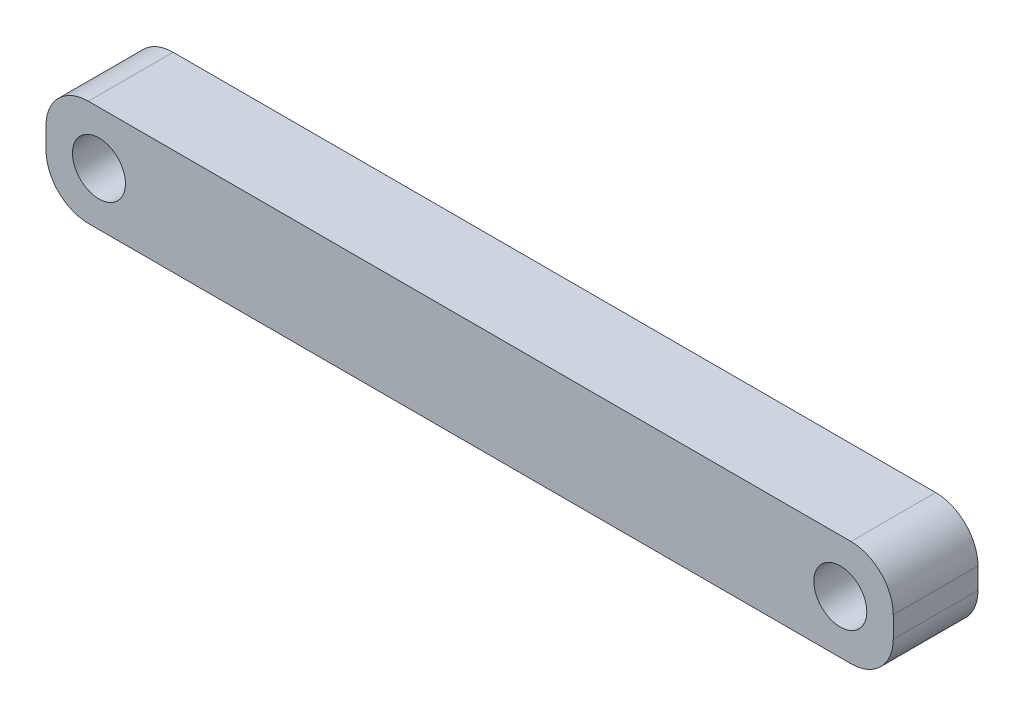
ISO-10303-21;
HEADER;
FILE_DESCRIPTION(('STEP AP214'),'2;1');
FILE_NAME('part.step','',(''),(''),'','','');
FILE_SCHEMA(('AUTOMOTIVE_DESIGN { 1 0 10303 214 1 1 1 1 }'));
ENDSEC;
DATA;
#1=APPLICATION_CONTEXT('core data for automotive mechanical design processes');
#2=APPLICATION_PROTOCOL_DEFINITION('international standard','automotive_design',2000,#1);
#3=PRODUCT_CONTEXT('',#1,'mechanical');
#4=PRODUCT('Part','Part','',(#3));
#5=PRODUCT_RELATED_PRODUCT_CATEGORY('part','',(#4));
#6=PRODUCT_DEFINITION_FORMATION('','',#4);
#7=PRODUCT_DEFINITION_CONTEXT('part definition',#1,'design');
#8=PRODUCT_DEFINITION('design','',#6,#7);
#9=PRODUCT_DEFINITION_SHAPE('','',#8);
#10=(LENGTH_UNIT() NAMED_UNIT(*) SI_UNIT(.MILLI.,.METRE.));
#11=(NAMED_UNIT(*) PLANE_ANGLE_UNIT() SI_UNIT($,.RADIAN.));
#12=(NAMED_UNIT(*) SI_UNIT($,.STERADIAN.) SOLID_ANGLE_UNIT());
#13=UNCERTAINTY_MEASURE_WITH_UNIT(LENGTH_MEASURE(1.E-05),#10,'distance_accuracy_value','');
#14=(GEOMETRIC_REPRESENTATION_CONTEXT(3) GLOBAL_UNCERTAINTY_ASSIGNED_CONTEXT((#13)) GLOBAL_UNIT_ASSIGNED_CONTEXT((#10,
#11,#12)) REPRESENTATION_CONTEXT('',''));
#15=CARTESIAN_POINT('',(0.,0.,0.));
#16=DIRECTION('',(0.,0.,1.));
#17=DIRECTION('',(1.,0.,0.));
#18=AXIS2_PLACEMENT_3D('',#15,#16,#17);
#19=CARTESIAN_POINT('',(0.,0.,8.));
#20=DIRECTION('',(0.,0.,-1.));
#21=DIRECTION('',(-1.,0.,0.));
#22=AXIS2_PLACEMENT_3D('',#19,#20,#21);
#23=PLANE('',#22);
#24=DIRECTION('',(1.,0.,0.));
#25=VECTOR('',#24,1.);
#26=CARTESIAN_POINT('',(-40.,-5.,8.));
#27=LINE('',#26,#25);
#28=CARTESIAN_POINT('',(-36.,-5.,8.));
#29=VERTEX_POINT('',#28);
#30=CARTESIAN_POINT('',(36.,-5.,8.));
#31=VERTEX_POINT('',#30);
#32=EDGE_CURVE('E135',#29,#31,#27,.T.);
#33=ORIENTED_EDGE('',*,*,#32,.T.);
#34=CARTESIAN_POINT('',(36.,-1.,8.));
#35=DIRECTION('',(0.,0.,-1.));
#36=DIRECTION('',(-1.,0.,0.));
#37=AXIS2_PLACEMENT_3D('',#34,#35,#36);
#38=CIRCLE('',#37,4.);
#39=CARTESIAN_POINT('',(40.,-1.,8.));
#40=VERTEX_POINT('',#39);
#41=EDGE_CURVE('E154',#31,#40,#38,.F.);
#42=ORIENTED_EDGE('',*,*,#41,.T.);
#43=DIRECTION('',(0.,1.,0.));
#44=VECTOR('',#43,1.);
#45=CARTESIAN_POINT('',(40.,-5.,8.));
#46=LINE('',#45,#44);
#47=CARTESIAN_POINT('',(40.,1.,8.));
#48=VERTEX_POINT('',#47);
#49=EDGE_CURVE('E118',#40,#48,#46,.T.);
#50=ORIENTED_EDGE('',*,*,#49,.T.);
#51=CARTESIAN_POINT('',(36.,1.,8.));
#52=DIRECTION('',(0.,0.,-1.));
#53=DIRECTION('',(-1.,0.,0.));
#54=AXIS2_PLACEMENT_3D('',#51,#52,#53);
#55=CIRCLE('',#54,4.);
#56=CARTESIAN_POINT('',(36.,5.,8.));
#57=VERTEX_POINT('',#56);
#58=EDGE_CURVE('E152',#48,#57,#55,.F.);
#59=ORIENTED_EDGE('',*,*,#58,.T.);
#60=DIRECTION('',(-1.,0.,0.));
#61=VECTOR('',#60,1.);
#62=CARTESIAN_POINT('',(-40.,5.,8.));
#63=LINE('',#62,#61);
#64=CARTESIAN_POINT('',(-36.,5.,8.));
#65=VERTEX_POINT('',#64);
#66=EDGE_CURVE('E174',#57,#65,#63,.T.);
#67=ORIENTED_EDGE('',*,*,#66,.T.);
#68=CARTESIAN_POINT('',(-36.,1.,8.));
#69=DIRECTION('',(0.,0.,-1.));
#70=DIRECTION('',(-1.,0.,0.));
#71=AXIS2_PLACEMENT_3D('',#68,#69,#70);
#72=CIRCLE('',#71,4.);
#73=CARTESIAN_POINT('',(-40.,1.,8.));
#74=VERTEX_POINT('',#73);
#75=EDGE_CURVE('E53',#65,#74,#72,.F.);
#76=ORIENTED_EDGE('',*,*,#75,.T.);
#77=DIRECTION('',(0.,-1.,0.));
#78=VECTOR('',#77,1.);
#79=CARTESIAN_POINT('',(-40.,-5.,8.));
#80=LINE('',#79,#78);
#81=CARTESIAN_POINT('',(-40.,-1.,8.));
#82=VERTEX_POINT('',#81);
#83=EDGE_CURVE('E164',#74,#82,#80,.T.);
#84=ORIENTED_EDGE('',*,*,#83,.T.);
#85=CARTESIAN_POINT('',(-36.,-1.,8.));
#86=DIRECTION('',(0.,0.,-1.));
#87=DIRECTION('',(-1.,0.,0.));
#88=AXIS2_PLACEMENT_3D('',#85,#86,#87);
#89=CIRCLE('',#88,4.);
#90=EDGE_CURVE('E150',#82,#29,#89,.F.);
#91=ORIENTED_EDGE('',*,*,#90,.T.);
#92=EDGE_LOOP('',(#33,#42,#50,#59,#67,#76,#84,#91));
#93=FACE_BOUND('',#92,.T.);
#94=CARTESIAN_POINT('',(-35.,0.,8.));
#95=DIRECTION('',(0.,0.,1.));
#96=DIRECTION('',(1.,0.,0.));
#97=AXIS2_PLACEMENT_3D('',#94,#95,#96);
#98=CIRCLE('',#97,2.5);
#99=CARTESIAN_POINT('',(-32.5,0.,8.));
#100=VERTEX_POINT('',#99);
#101=EDGE_CURVE('E126',#100,#100,#98,.T.);
#102=ORIENTED_EDGE('',*,*,#101,.F.);
#103=EDGE_LOOP('',(#102));
#104=FACE_BOUND('',#103,.T.);
#105=CARTESIAN_POINT('',(35.,0.,8.));
#106=DIRECTION('',(0.,0.,1.));
#107=DIRECTION('',(1.,0.,0.));
#108=AXIS2_PLACEMENT_3D('',#105,#106,#107);
#109=CIRCLE('',#108,2.49999999999999);
#110=CARTESIAN_POINT('',(37.5,0.,8.));
#111=VERTEX_POINT('',#110);
#112=EDGE_CURVE('E179',#111,#111,#109,.T.);
#113=ORIENTED_EDGE('',*,*,#112,.F.);
#114=EDGE_LOOP('',(#113));
#115=FACE_BOUND('',#114,.T.);
#116=ADVANCED_FACE('F33',(#93,#104,#115),#23,.F.);
#117=CARTESIAN_POINT('',(0.,0.,0.));
#118=DIRECTION('',(0.,0.,-1.));
#119=DIRECTION('',(-1.,0.,0.));
#120=AXIS2_PLACEMENT_3D('',#117,#118,#119);
#121=PLANE('',#120);
#122=CARTESIAN_POINT('',(-35.,0.,0.));
#123=DIRECTION('',(0.,0.,1.));
#124=DIRECTION('',(1.,0.,0.));
#125=AXIS2_PLACEMENT_3D('',#122,#123,#124);
#126=CIRCLE('',#125,2.5);
#127=CARTESIAN_POINT('',(-32.5,0.,0.));
#128=VERTEX_POINT('',#127);
#129=EDGE_CURVE('E132',#128,#128,#126,.T.);
#130=ORIENTED_EDGE('',*,*,#129,.T.);
#131=EDGE_LOOP('',(#130));
#132=FACE_BOUND('',#131,.T.);
#133=DIRECTION('',(0.,1.,0.));
#134=VECTOR('',#133,1.);
#135=CARTESIAN_POINT('',(40.,-5.,0.));
#136=LINE('',#135,#134);
#137=CARTESIAN_POINT('',(40.,-1.,0.));
#138=VERTEX_POINT('',#137);
#139=CARTESIAN_POINT('',(40.,1.,0.));
#140=VERTEX_POINT('',#139);
#141=EDGE_CURVE('E115',#138,#140,#136,.T.);
#142=ORIENTED_EDGE('',*,*,#141,.F.);
#143=CARTESIAN_POINT('',(36.,-1.,0.));
#144=DIRECTION('',(0.,0.,-1.));
#145=DIRECTION('',(-1.,0.,0.));
#146=AXIS2_PLACEMENT_3D('',#143,#144,#145);
#147=CIRCLE('',#146,4.);
#148=CARTESIAN_POINT('',(36.,-5.,0.));
#149=VERTEX_POINT('',#148);
#150=EDGE_CURVE('E98',#138,#149,#147,.T.);
#151=ORIENTED_EDGE('',*,*,#150,.T.);
#152=DIRECTION('',(1.,0.,0.));
#153=VECTOR('',#152,1.);
#154=CARTESIAN_POINT('',(-40.,-5.,0.));
#155=LINE('',#154,#153);
#156=CARTESIAN_POINT('',(-36.,-5.,0.));
#157=VERTEX_POINT('',#156);
#158=EDGE_CURVE('E139',#157,#149,#155,.T.);
#159=ORIENTED_EDGE('',*,*,#158,.F.);
#160=CARTESIAN_POINT('',(-36.,-1.,0.));
#161=DIRECTION('',(0.,0.,-1.));
#162=DIRECTION('',(-1.,0.,0.));
#163=AXIS2_PLACEMENT_3D('',#160,#161,#162);
#164=CIRCLE('',#163,4.);
#165=CARTESIAN_POINT('',(-40.,-1.,0.));
#166=VERTEX_POINT('',#165);
#167=EDGE_CURVE('E143',#157,#166,#164,.T.);
#168=ORIENTED_EDGE('',*,*,#167,.T.);
#169=DIRECTION('',(0.,-1.,0.));
#170=VECTOR('',#169,1.);
#171=CARTESIAN_POINT('',(-40.,-5.,0.));
#172=LINE('',#171,#170);
#173=CARTESIAN_POINT('',(-40.,1.,0.));
#174=VERTEX_POINT('',#173);
#175=EDGE_CURVE('E129',#174,#166,#172,.T.);
#176=ORIENTED_EDGE('',*,*,#175,.F.);
#177=CARTESIAN_POINT('',(-36.,1.,0.));
#178=DIRECTION('',(0.,0.,-1.));
#179=DIRECTION('',(-1.,0.,0.));
#180=AXIS2_PLACEMENT_3D('',#177,#178,#179);
#181=CIRCLE('',#180,4.);
#182=CARTESIAN_POINT('',(-36.,5.,0.));
#183=VERTEX_POINT('',#182);
#184=EDGE_CURVE('E119',#174,#183,#181,.T.);
#185=ORIENTED_EDGE('',*,*,#184,.T.);
#186=DIRECTION('',(-1.,0.,0.));
#187=VECTOR('',#186,1.);
#188=CARTESIAN_POINT('',(-40.,5.,0.));
#189=LINE('',#188,#187);
#190=CARTESIAN_POINT('',(36.,5.,0.));
#191=VERTEX_POINT('',#190);
#192=EDGE_CURVE('E125',#191,#183,#189,.T.);
#193=ORIENTED_EDGE('',*,*,#192,.F.);
#194=CARTESIAN_POINT('',(36.,1.,0.));
#195=DIRECTION('',(0.,0.,-1.));
#196=DIRECTION('',(-1.,0.,0.));
#197=AXIS2_PLACEMENT_3D('',#194,#195,#196);
#198=CIRCLE('',#197,4.);
#199=EDGE_CURVE('E109',#191,#140,#198,.T.);
#200=ORIENTED_EDGE('',*,*,#199,.T.);
#201=EDGE_LOOP('',(#142,#151,#159,#168,#176,#185,#193,#200));
#202=FACE_BOUND('',#201,.T.);
#203=CARTESIAN_POINT('',(35.,0.,0.));
#204=DIRECTION('',(0.,0.,1.));
#205=DIRECTION('',(1.,0.,0.));
#206=AXIS2_PLACEMENT_3D('',#203,#204,#205);
#207=CIRCLE('',#206,2.49999999999999);
#208=CARTESIAN_POINT('',(37.5,0.,0.));
#209=VERTEX_POINT('',#208);
#210=EDGE_CURVE('E181',#209,#209,#207,.T.);
#211=ORIENTED_EDGE('',*,*,#210,.T.);
#212=EDGE_LOOP('',(#211));
#213=FACE_BOUND('',#212,.T.);
#214=ADVANCED_FACE('F122',(#132,#202,#213),#121,.T.);
#215=CARTESIAN_POINT('',(40.,-5.,8.));
#216=DIRECTION('',(-1.,0.,0.));
#217=DIRECTION('',(0.,0.,1.));
#218=AXIS2_PLACEMENT_3D('',#215,#216,#217);
#219=PLANE('',#218);
#220=ORIENTED_EDGE('',*,*,#49,.F.);
#221=DIRECTION('',(0.,0.,-1.));
#222=VECTOR('',#221,1.);
#223=CARTESIAN_POINT('',(40.,-1.,8.));
#224=LINE('',#223,#222);
#225=EDGE_CURVE('E102',#40,#138,#224,.T.);
#226=ORIENTED_EDGE('',*,*,#225,.T.);
#227=ORIENTED_EDGE('',*,*,#141,.T.);
#228=DIRECTION('',(0.,0.,-1.));
#229=VECTOR('',#228,1.);
#230=CARTESIAN_POINT('',(40.,1.,8.));
#231=LINE('',#230,#229);
#232=EDGE_CURVE('E120',#140,#48,#231,.F.);
#233=ORIENTED_EDGE('',*,*,#232,.T.);
#234=EDGE_LOOP('',(#220,#226,#227,#233));
#235=FACE_BOUND('',#234,.T.);
#236=ADVANCED_FACE('F114',(#235),#219,.F.);
#237=CARTESIAN_POINT('',(-40.,5.,8.));
#238=DIRECTION('',(0.,-1.,0.));
#239=DIRECTION('',(0.,0.,-1.));
#240=AXIS2_PLACEMENT_3D('',#237,#238,#239);
#241=PLANE('',#240);
#242=ORIENTED_EDGE('',*,*,#66,.F.);
#243=DIRECTION('',(0.,0.,-1.));
#244=VECTOR('',#243,1.);
#245=CARTESIAN_POINT('',(36.,5.,8.));
#246=LINE('',#245,#244);
#247=EDGE_CURVE('E158',#57,#191,#246,.T.);
#248=ORIENTED_EDGE('',*,*,#247,.T.);
#249=ORIENTED_EDGE('',*,*,#192,.T.);
#250=DIRECTION('',(0.,0.,-1.));
#251=VECTOR('',#250,1.);
#252=CARTESIAN_POINT('',(-36.,5.,8.));
#253=LINE('',#252,#251);
#254=EDGE_CURVE('E156',#183,#65,#253,.F.);
#255=ORIENTED_EDGE('',*,*,#254,.T.);
#256=EDGE_LOOP('',(#242,#248,#249,#255));
#257=FACE_BOUND('',#256,.T.);
#258=ADVANCED_FACE('F206',(#257),#241,.F.);
#259=CARTESIAN_POINT('',(-40.,-5.,8.));
#260=DIRECTION('',(1.,0.,0.));
#261=DIRECTION('',(0.,0.,-1.));
#262=AXIS2_PLACEMENT_3D('',#259,#260,#261);
#263=PLANE('',#262);
#264=ORIENTED_EDGE('',*,*,#175,.T.);
#265=DIRECTION('',(0.,0.,-1.));
#266=VECTOR('',#265,1.);
#267=CARTESIAN_POINT('',(-40.,-1.,8.));
#268=LINE('',#267,#266);
#269=EDGE_CURVE('E11',#166,#82,#268,.F.);
#270=ORIENTED_EDGE('',*,*,#269,.T.);
#271=ORIENTED_EDGE('',*,*,#83,.F.);
#272=DIRECTION('',(0.,0.,-1.));
#273=VECTOR('',#272,1.);
#274=CARTESIAN_POINT('',(-40.,1.,8.));
#275=LINE('',#274,#273);
#276=EDGE_CURVE('E41',#74,#174,#275,.T.);
#277=ORIENTED_EDGE('',*,*,#276,.T.);
#278=EDGE_LOOP('',(#264,#270,#271,#277));
#279=FACE_BOUND('',#278,.T.);
#280=ADVANCED_FACE('F163',(#279),#263,.F.);
#281=CARTESIAN_POINT('',(-40.,-5.,8.));
#282=DIRECTION('',(0.,1.,0.));
#283=DIRECTION('',(0.,0.,1.));
#284=AXIS2_PLACEMENT_3D('',#281,#282,#283);
#285=PLANE('',#284);
#286=ORIENTED_EDGE('',*,*,#158,.T.);
#287=DIRECTION('',(0.,0.,-1.));
#288=VECTOR('',#287,1.);
#289=CARTESIAN_POINT('',(36.,-5.,8.));
#290=LINE('',#289,#288);
#291=EDGE_CURVE('E103',#149,#31,#290,.F.);
#292=ORIENTED_EDGE('',*,*,#291,.T.);
#293=ORIENTED_EDGE('',*,*,#32,.F.);
#294=DIRECTION('',(0.,0.,-1.));
#295=VECTOR('',#294,1.);
#296=CARTESIAN_POINT('',(-36.,-5.,8.));
#297=LINE('',#296,#295);
#298=EDGE_CURVE('E108',#29,#157,#297,.T.);
#299=ORIENTED_EDGE('',*,*,#298,.T.);
#300=EDGE_LOOP('',(#286,#292,#293,#299));
#301=FACE_BOUND('',#300,.T.);
#302=ADVANCED_FACE('F172',(#301),#285,.F.);
#303=CARTESIAN_POINT('',(-35.,0.,8.));
#304=DIRECTION('',(0.,0.,-1.));
#305=DIRECTION('',(-1.,0.,0.));
#306=AXIS2_PLACEMENT_3D('',#303,#304,#305);
#307=CYLINDRICAL_SURFACE('',#306,2.5);
#308=ORIENTED_EDGE('',*,*,#101,.T.);
#309=EDGE_LOOP('',(#308));
#310=FACE_BOUND('',#309,.T.);
#311=ORIENTED_EDGE('',*,*,#129,.F.);
#312=EDGE_LOOP('',(#311));
#313=FACE_BOUND('',#312,.T.);
#314=ADVANCED_FACE('F199',(#310,#313),#307,.F.);
#315=CARTESIAN_POINT('',(35.,0.,8.));
#316=DIRECTION('',(0.,0.,-1.));
#317=DIRECTION('',(-1.,0.,0.));
#318=AXIS2_PLACEMENT_3D('',#315,#316,#317);
#319=CYLINDRICAL_SURFACE('',#318,2.49999999999999);
#320=ORIENTED_EDGE('',*,*,#112,.T.);
#321=EDGE_LOOP('',(#320));
#322=FACE_BOUND('',#321,.T.);
#323=ORIENTED_EDGE('',*,*,#210,.F.);
#324=EDGE_LOOP('',(#323));
#325=FACE_BOUND('',#324,.T.);
#326=ADVANCED_FACE('F187',(#322,#325),#319,.F.);
#327=CARTESIAN_POINT('',(36.,-1.,8.));
#328=DIRECTION('',(0.,0.,-1.));
#329=DIRECTION('',(-1.,0.,0.));
#330=AXIS2_PLACEMENT_3D('',#327,#328,#329);
#331=CYLINDRICAL_SURFACE('',#330,4.);
#332=ORIENTED_EDGE('',*,*,#41,.F.);
#333=ORIENTED_EDGE('',*,*,#291,.F.);
#334=ORIENTED_EDGE('',*,*,#150,.F.);
#335=ORIENTED_EDGE('',*,*,#225,.F.);
#336=EDGE_LOOP('',(#332,#333,#334,#335));
#337=FACE_BOUND('',#336,.T.);
#338=ADVANCED_FACE('F101',(#337),#331,.T.);
#339=CARTESIAN_POINT('',(36.,1.,8.));
#340=DIRECTION('',(0.,0.,-1.));
#341=DIRECTION('',(-1.,0.,0.));
#342=AXIS2_PLACEMENT_3D('',#339,#340,#341);
#343=CYLINDRICAL_SURFACE('',#342,4.);
#344=ORIENTED_EDGE('',*,*,#58,.F.);
#345=ORIENTED_EDGE('',*,*,#232,.F.);
#346=ORIENTED_EDGE('',*,*,#199,.F.);
#347=ORIENTED_EDGE('',*,*,#247,.F.);
#348=EDGE_LOOP('',(#344,#345,#346,#347));
#349=FACE_BOUND('',#348,.T.);
#350=ADVANCED_FACE('F214',(#349),#343,.T.);
#351=CARTESIAN_POINT('',(-36.,-1.,8.));
#352=DIRECTION('',(0.,0.,-1.));
#353=DIRECTION('',(-1.,0.,0.));
#354=AXIS2_PLACEMENT_3D('',#351,#352,#353);
#355=CYLINDRICAL_SURFACE('',#354,4.);
#356=ORIENTED_EDGE('',*,*,#90,.F.);
#357=ORIENTED_EDGE('',*,*,#269,.F.);
#358=ORIENTED_EDGE('',*,*,#167,.F.);
#359=ORIENTED_EDGE('',*,*,#298,.F.);
#360=EDGE_LOOP('',(#356,#357,#358,#359));
#361=FACE_BOUND('',#360,.T.);
#362=ADVANCED_FACE('F169',(#361),#355,.T.);
#363=CARTESIAN_POINT('',(-36.,1.,8.));
#364=DIRECTION('',(0.,0.,-1.));
#365=DIRECTION('',(-1.,0.,0.));
#366=AXIS2_PLACEMENT_3D('',#363,#364,#365);
#367=CYLINDRICAL_SURFACE('',#366,4.);
#368=ORIENTED_EDGE('',*,*,#75,.F.);
#369=ORIENTED_EDGE('',*,*,#254,.F.);
#370=ORIENTED_EDGE('',*,*,#184,.F.);
#371=ORIENTED_EDGE('',*,*,#276,.F.);
#372=EDGE_LOOP('',(#368,#369,#370,#371));
#373=FACE_BOUND('',#372,.T.);
#374=ADVANCED_FACE('F35',(#373),#367,.T.);
#375=CLOSED_SHELL('',(#116,#214,#236,#258,#280,#302,#314,#326,#338,#350,#362,#374));
#376=MANIFOLD_SOLID_BREP('B2',#375);
#377=ADVANCED_BREP_SHAPE_REPRESENTATION('',(#18,#376),#14);
#378=SHAPE_DEFINITION_REPRESENTATION(#9,#377);
ENDSEC;
END-ISO-10303-21;
